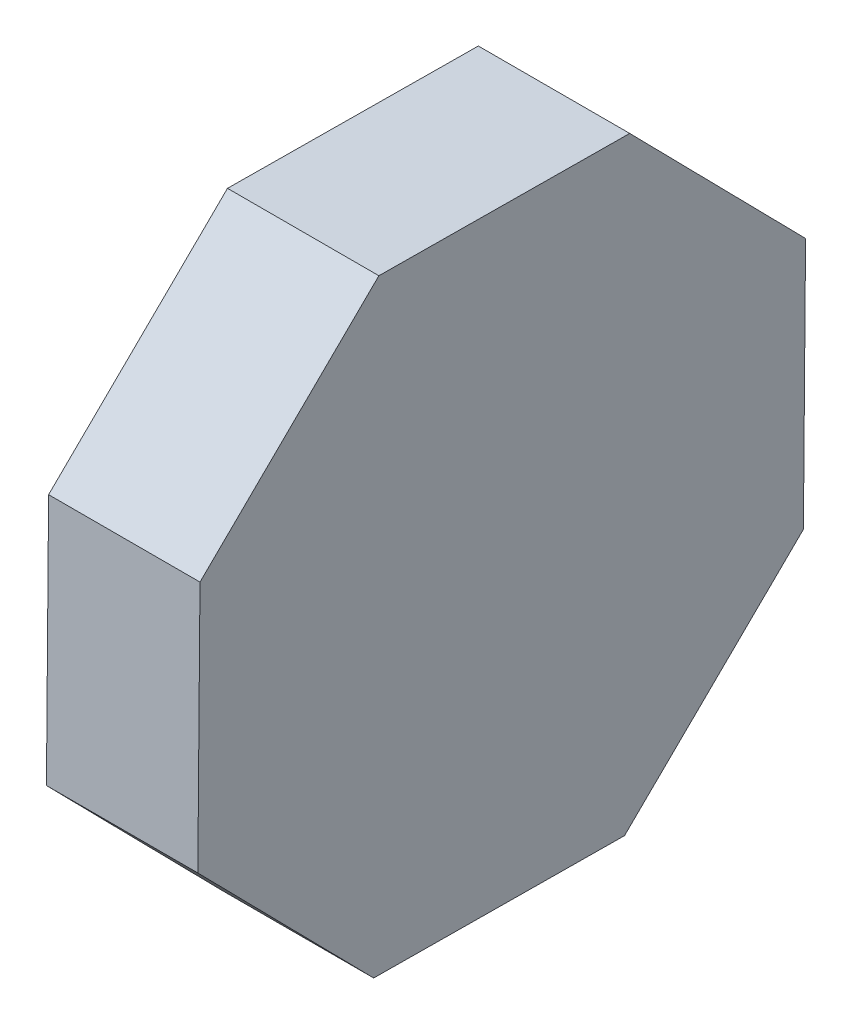
ISO-10303-21;
HEADER;
FILE_DESCRIPTION(('STEP AP214'),'2;1');
FILE_NAME('part.step','',(''),(''),'','','');
FILE_SCHEMA(('AUTOMOTIVE_DESIGN { 1 0 10303 214 1 1 1 1 }'));
ENDSEC;
DATA;
#1=APPLICATION_CONTEXT('core data for automotive mechanical design processes');
#2=APPLICATION_PROTOCOL_DEFINITION('international standard','automotive_design',2000,#1);
#3=PRODUCT_CONTEXT('',#1,'mechanical');
#4=PRODUCT('Part','Part','',(#3));
#5=PRODUCT_RELATED_PRODUCT_CATEGORY('part','',(#4));
#6=PRODUCT_DEFINITION_FORMATION('','',#4);
#7=PRODUCT_DEFINITION_CONTEXT('part definition',#1,'design');
#8=PRODUCT_DEFINITION('design','',#6,#7);
#9=PRODUCT_DEFINITION_SHAPE('','',#8);
#10=(LENGTH_UNIT() NAMED_UNIT(*) SI_UNIT(.MILLI.,.METRE.));
#11=(NAMED_UNIT(*) PLANE_ANGLE_UNIT() SI_UNIT($,.RADIAN.));
#12=(NAMED_UNIT(*) SI_UNIT($,.STERADIAN.) SOLID_ANGLE_UNIT());
#13=UNCERTAINTY_MEASURE_WITH_UNIT(LENGTH_MEASURE(1.E-05),#10,'distance_accuracy_value','');
#14=(GEOMETRIC_REPRESENTATION_CONTEXT(3) GLOBAL_UNCERTAINTY_ASSIGNED_CONTEXT((#13)) GLOBAL_UNIT_ASSIGNED_CONTEXT((#10,
#11,#12)) REPRESENTATION_CONTEXT('',''));
#15=CARTESIAN_POINT('',(0.,0.,0.));
#16=DIRECTION('',(0.,0.,1.));
#17=DIRECTION('',(1.,0.,0.));
#18=AXIS2_PLACEMENT_3D('',#15,#16,#17);
#19=CARTESIAN_POINT('',(9.525,-19.1172649539858,-7.72637729087209));
#20=DIRECTION('',(0.,0.713171623735108,0.700989468607789));
#21=DIRECTION('',(0.,-0.700989468607789,0.713171623735108));
#22=AXIS2_PLACEMENT_3D('',#19,#20,#21);
#23=PLANE('',#22);
#24=DIRECTION('',(0.,0.700989468607789,-0.713171623735108));
#25=VECTOR('',#24,1.);
#26=CARTESIAN_POINT('',(0.,-19.1172649539858,-7.72637729087209));
#27=LINE('',#26,#25);
#28=CARTESIAN_POINT('',(0.,-19.1172649539858,-7.72637729087209));
#29=VERTEX_POINT('',#28);
#30=CARTESIAN_POINT('',(0.,-8.05457391032186,-18.9813214630847));
#31=VERTEX_POINT('',#30);
#32=EDGE_CURVE('E129',#29,#31,#27,.T.);
#33=ORIENTED_EDGE('',*,*,#32,.T.);
#34=DIRECTION('',(-1.,0.,0.));
#35=VECTOR('',#34,1.);
#36=CARTESIAN_POINT('',(9.525,-8.05457391032186,-18.9813214630847));
#37=LINE('',#36,#35);
#38=CARTESIAN_POINT('',(9.525,-8.05457391032186,-18.9813214630847));
#39=VERTEX_POINT('',#38);
#40=EDGE_CURVE('E11',#39,#31,#37,.T.);
#41=ORIENTED_EDGE('',*,*,#40,.F.);
#42=DIRECTION('',(0.,0.700989468607789,-0.713171623735108));
#43=VECTOR('',#42,1.);
#44=CARTESIAN_POINT('',(9.525,-19.1172649539858,-7.72637729087209));
#45=LINE('',#44,#43);
#46=CARTESIAN_POINT('',(9.525,-19.1172649539858,-7.72637729087209));
#47=VERTEX_POINT('',#46);
#48=EDGE_CURVE('E144',#47,#39,#45,.T.);
#49=ORIENTED_EDGE('',*,*,#48,.F.);
#50=DIRECTION('',(-1.,0.,0.));
#51=VECTOR('',#50,1.);
#52=CARTESIAN_POINT('',(9.525,-19.1172649539858,-7.72637729087209));
#53=LINE('',#52,#51);
#54=EDGE_CURVE('E125',#47,#29,#53,.T.);
#55=ORIENTED_EDGE('',*,*,#54,.T.);
#56=EDGE_LOOP('',(#33,#41,#49,#55));
#57=FACE_BOUND('',#56,.T.);
#58=ADVANCED_FACE('F33',(#57),#23,.F.);
#59=CARTESIAN_POINT('',(9.525,-8.05457391032186,-18.9813214630847));
#60=DIRECTION('',(0.,0.00861408449999269,0.999962898085837));
#61=DIRECTION('',(0.,-0.999962898085838,0.00861408449999269));
#62=AXIS2_PLACEMENT_3D('',#59,#60,#61);
#63=PLANE('',#62);
#64=DIRECTION('',(0.,0.999962898085837,-0.00861408449999269));
#65=VECTOR('',#64,1.);
#66=CARTESIAN_POINT('',(0.,-8.05457391032186,-18.9813214630847));
#67=LINE('',#66,#65);
#68=CARTESIAN_POINT('',(0.,7.7263772908721,-19.1172649539857));
#69=VERTEX_POINT('',#68);
#70=EDGE_CURVE('E132',#31,#69,#67,.T.);
#71=ORIENTED_EDGE('',*,*,#70,.T.);
#72=DIRECTION('',(-1.,0.,0.));
#73=VECTOR('',#72,1.);
#74=CARTESIAN_POINT('',(9.525,7.7263772908721,-19.1172649539857));
#75=LINE('',#74,#73);
#76=CARTESIAN_POINT('',(9.525,7.7263772908721,-19.1172649539857));
#77=VERTEX_POINT('',#76);
#78=EDGE_CURVE('E41',#77,#69,#75,.T.);
#79=ORIENTED_EDGE('',*,*,#78,.F.);
#80=DIRECTION('',(0.,0.999962898085837,-0.00861408449999269));
#81=VECTOR('',#80,1.);
#82=CARTESIAN_POINT('',(9.525,-8.05457391032186,-18.9813214630847));
#83=LINE('',#82,#81);
#84=EDGE_CURVE('E92',#39,#77,#83,.T.);
#85=ORIENTED_EDGE('',*,*,#84,.F.);
#86=ORIENTED_EDGE('',*,*,#40,.T.);
#87=EDGE_LOOP('',(#71,#79,#85,#86));
#88=FACE_BOUND('',#87,.T.);
#89=ADVANCED_FACE('F200',(#88),#63,.F.);
#90=CARTESIAN_POINT('',(9.525,7.7263772908721,-19.1172649539857));
#91=DIRECTION('',(0.,-0.700989468607789,0.713171623735108));
#92=DIRECTION('',(0.,-0.713171623735108,-0.700989468607789));
#93=AXIS2_PLACEMENT_3D('',#90,#91,#92);
#94=PLANE('',#93);
#95=DIRECTION('',(0.,0.713171623735108,0.700989468607789));
#96=VECTOR('',#95,1.);
#97=CARTESIAN_POINT('',(0.,7.7263772908721,-19.1172649539857));
#98=LINE('',#97,#96);
#99=CARTESIAN_POINT('',(0.,18.9813214630847,-8.05457391032181));
#100=VERTEX_POINT('',#99);
#101=EDGE_CURVE('E135',#69,#100,#98,.T.);
#102=ORIENTED_EDGE('',*,*,#101,.T.);
#103=DIRECTION('',(-1.,0.,0.));
#104=VECTOR('',#103,1.);
#105=CARTESIAN_POINT('',(9.525,18.9813214630847,-8.05457391032181));
#106=LINE('',#105,#104);
#107=CARTESIAN_POINT('',(9.525,18.9813214630847,-8.05457391032181));
#108=VERTEX_POINT('',#107);
#109=EDGE_CURVE('E151',#108,#100,#106,.T.);
#110=ORIENTED_EDGE('',*,*,#109,.F.);
#111=DIRECTION('',(0.,0.713171623735108,0.700989468607789));
#112=VECTOR('',#111,1.);
#113=CARTESIAN_POINT('',(9.525,7.7263772908721,-19.1172649539857));
#114=LINE('',#113,#112);
#115=EDGE_CURVE('E159',#77,#108,#114,.T.);
#116=ORIENTED_EDGE('',*,*,#115,.F.);
#117=ORIENTED_EDGE('',*,*,#78,.T.);
#118=EDGE_LOOP('',(#102,#110,#116,#117));
#119=FACE_BOUND('',#118,.T.);
#120=ADVANCED_FACE('F157',(#119),#94,.F.);
#121=CARTESIAN_POINT('',(9.525,18.9813214630847,-8.05457391032181));
#122=DIRECTION('',(0.,-0.999962898085837,0.00861408449999315));
#123=DIRECTION('',(0.,-0.00861408449999315,-0.999962898085837));
#124=AXIS2_PLACEMENT_3D('',#121,#122,#123);
#125=PLANE('',#124);
#126=DIRECTION('',(0.,0.00861408449999316,0.999962898085838));
#127=VECTOR('',#126,1.);
#128=CARTESIAN_POINT('',(0.,18.9813214630847,-8.05457391032181));
#129=LINE('',#128,#127);
#130=CARTESIAN_POINT('',(0.,19.1172649539858,7.72637729087209));
#131=VERTEX_POINT('',#130);
#132=EDGE_CURVE('E137',#100,#131,#129,.T.);
#133=ORIENTED_EDGE('',*,*,#132,.T.);
#134=DIRECTION('',(-1.,0.,0.));
#135=VECTOR('',#134,1.);
#136=CARTESIAN_POINT('',(9.525,19.1172649539858,7.72637729087209));
#137=LINE('',#136,#135);
#138=CARTESIAN_POINT('',(9.525,19.1172649539858,7.72637729087209));
#139=VERTEX_POINT('',#138);
#140=EDGE_CURVE('E148',#139,#131,#137,.T.);
#141=ORIENTED_EDGE('',*,*,#140,.F.);
#142=DIRECTION('',(0.,0.00861408449999316,0.999962898085838));
#143=VECTOR('',#142,1.);
#144=CARTESIAN_POINT('',(9.525,18.9813214630847,-8.05457391032181));
#145=LINE('',#144,#143);
#146=EDGE_CURVE('E171',#108,#139,#145,.T.);
#147=ORIENTED_EDGE('',*,*,#146,.F.);
#148=ORIENTED_EDGE('',*,*,#109,.T.);
#149=EDGE_LOOP('',(#133,#141,#147,#148));
#150=FACE_BOUND('',#149,.T.);
#151=ADVANCED_FACE('F167',(#150),#125,.F.);
#152=CARTESIAN_POINT('',(9.525,19.1172649539858,7.72637729087209));
#153=DIRECTION('',(0.,-0.713171623735108,-0.700989468607789));
#154=DIRECTION('',(0.,0.700989468607789,-0.713171623735108));
#155=AXIS2_PLACEMENT_3D('',#152,#153,#154);
#156=PLANE('',#155);
#157=DIRECTION('',(0.,-0.700989468607789,0.713171623735108));
#158=VECTOR('',#157,1.);
#159=CARTESIAN_POINT('',(0.,19.1172649539858,7.72637729087209));
#160=LINE('',#159,#158);
#161=CARTESIAN_POINT('',(0.,8.05457391032185,18.9813214630847));
#162=VERTEX_POINT('',#161);
#163=EDGE_CURVE('E139',#131,#162,#160,.T.);
#164=ORIENTED_EDGE('',*,*,#163,.T.);
#165=DIRECTION('',(-1.,0.,0.));
#166=VECTOR('',#165,1.);
#167=CARTESIAN_POINT('',(9.525,8.05457391032185,18.9813214630847));
#168=LINE('',#167,#166);
#169=CARTESIAN_POINT('',(9.525,8.05457391032185,18.9813214630847));
#170=VERTEX_POINT('',#169);
#171=EDGE_CURVE('E120',#170,#162,#168,.T.);
#172=ORIENTED_EDGE('',*,*,#171,.F.);
#173=DIRECTION('',(0.,-0.700989468607789,0.713171623735108));
#174=VECTOR('',#173,1.);
#175=CARTESIAN_POINT('',(9.525,19.1172649539858,7.72637729087209));
#176=LINE('',#175,#174);
#177=EDGE_CURVE('E111',#139,#170,#176,.T.);
#178=ORIENTED_EDGE('',*,*,#177,.F.);
#179=ORIENTED_EDGE('',*,*,#140,.T.);
#180=EDGE_LOOP('',(#164,#172,#178,#179));
#181=FACE_BOUND('',#180,.T.);
#182=ADVANCED_FACE('F170',(#181),#156,.F.);
#183=CARTESIAN_POINT('',(9.525,8.05457391032185,18.9813214630847));
#184=DIRECTION('',(0.,-0.00861408449999314,-0.999962898085837));
#185=DIRECTION('',(0.,0.999962898085838,-0.00861408449999314));
#186=AXIS2_PLACEMENT_3D('',#183,#184,#185);
#187=PLANE('',#186);
#188=DIRECTION('',(0.,-0.999962898085837,0.00861408449999314));
#189=VECTOR('',#188,1.);
#190=CARTESIAN_POINT('',(0.,8.05457391032185,18.9813214630847));
#191=LINE('',#190,#189);
#192=CARTESIAN_POINT('',(0.,-7.72637729087209,19.1172649539858));
#193=VERTEX_POINT('',#192);
#194=EDGE_CURVE('E119',#162,#193,#191,.T.);
#195=ORIENTED_EDGE('',*,*,#194,.T.);
#196=DIRECTION('',(-1.,0.,0.));
#197=VECTOR('',#196,1.);
#198=CARTESIAN_POINT('',(9.525,-7.72637729087209,19.1172649539858));
#199=LINE('',#198,#197);
#200=CARTESIAN_POINT('',(9.525,-7.72637729087209,19.1172649539858));
#201=VERTEX_POINT('',#200);
#202=EDGE_CURVE('E116',#201,#193,#199,.T.);
#203=ORIENTED_EDGE('',*,*,#202,.F.);
#204=DIRECTION('',(0.,-0.999962898085837,0.00861408449999314));
#205=VECTOR('',#204,1.);
#206=CARTESIAN_POINT('',(9.525,8.05457391032185,18.9813214630847));
#207=LINE('',#206,#205);
#208=EDGE_CURVE('E105',#170,#201,#207,.T.);
#209=ORIENTED_EDGE('',*,*,#208,.F.);
#210=ORIENTED_EDGE('',*,*,#171,.T.);
#211=EDGE_LOOP('',(#195,#203,#209,#210));
#212=FACE_BOUND('',#211,.T.);
#213=ADVANCED_FACE('F117',(#212),#187,.F.);
#214=CARTESIAN_POINT('',(9.525,-7.72637729087209,19.1172649539858));
#215=DIRECTION('',(0.,0.700989468607788,-0.713171623735108));
#216=DIRECTION('',(0.,0.713171623735108,0.700989468607788));
#217=AXIS2_PLACEMENT_3D('',#214,#215,#216);
#218=PLANE('',#217);
#219=DIRECTION('',(0.,-0.713171623735108,-0.700989468607788));
#220=VECTOR('',#219,1.);
#221=CARTESIAN_POINT('',(0.,-7.72637729087209,19.1172649539858));
#222=LINE('',#221,#220);
#223=CARTESIAN_POINT('',(0.,-18.9813214630847,8.05457391032187));
#224=VERTEX_POINT('',#223);
#225=EDGE_CURVE('E78',#193,#224,#222,.T.);
#226=ORIENTED_EDGE('',*,*,#225,.T.);
#227=DIRECTION('',(-1.,0.,0.));
#228=VECTOR('',#227,1.);
#229=CARTESIAN_POINT('',(9.525,-18.9813214630847,8.05457391032187));
#230=LINE('',#229,#228);
#231=CARTESIAN_POINT('',(9.525,-18.9813214630847,8.05457391032187));
#232=VERTEX_POINT('',#231);
#233=EDGE_CURVE('E121',#232,#224,#230,.T.);
#234=ORIENTED_EDGE('',*,*,#233,.F.);
#235=DIRECTION('',(0.,-0.713171623735108,-0.700989468607788));
#236=VECTOR('',#235,1.);
#237=CARTESIAN_POINT('',(9.525,-7.72637729087209,19.1172649539858));
#238=LINE('',#237,#236);
#239=EDGE_CURVE('E109',#201,#232,#238,.T.);
#240=ORIENTED_EDGE('',*,*,#239,.F.);
#241=ORIENTED_EDGE('',*,*,#202,.T.);
#242=EDGE_LOOP('',(#226,#234,#240,#241));
#243=FACE_BOUND('',#242,.T.);
#244=ADVANCED_FACE('F123',(#243),#218,.F.);
#245=CARTESIAN_POINT('',(9.525,-18.9813214630847,8.05457391032187));
#246=DIRECTION('',(0.,0.999962898085837,-0.00861408449999356));
#247=DIRECTION('',(0.,0.00861408449999357,0.999962898085838));
#248=AXIS2_PLACEMENT_3D('',#245,#246,#247);
#249=PLANE('',#248);
#250=DIRECTION('',(0.,-0.00861408449999357,-0.999962898085837));
#251=VECTOR('',#250,1.);
#252=CARTESIAN_POINT('',(0.,-18.9813214630847,8.05457391032187));
#253=LINE('',#252,#251);
#254=EDGE_CURVE('E84',#224,#29,#253,.T.);
#255=ORIENTED_EDGE('',*,*,#254,.T.);
#256=ORIENTED_EDGE('',*,*,#54,.F.);
#257=DIRECTION('',(0.,-0.00861408449999357,-0.999962898085837));
#258=VECTOR('',#257,1.);
#259=CARTESIAN_POINT('',(9.525,-18.9813214630847,8.05457391032187));
#260=LINE('',#259,#258);
#261=EDGE_CURVE('E49',#232,#47,#260,.T.);
#262=ORIENTED_EDGE('',*,*,#261,.F.);
#263=ORIENTED_EDGE('',*,*,#233,.T.);
#264=EDGE_LOOP('',(#255,#256,#262,#263));
#265=FACE_BOUND('',#264,.T.);
#266=ADVANCED_FACE('F196',(#265),#249,.F.);
#267=CARTESIAN_POINT('',(9.525,-0.232070055175438,-26.9397688091322));
#268=DIRECTION('',(1.,0.,0.));
#269=DIRECTION('',(0.,0.,-1.));
#270=AXIS2_PLACEMENT_3D('',#267,#268,#269);
#271=PLANE('',#270);
#272=ORIENTED_EDGE('',*,*,#48,.T.);
#273=ORIENTED_EDGE('',*,*,#84,.T.);
#274=ORIENTED_EDGE('',*,*,#115,.T.);
#275=ORIENTED_EDGE('',*,*,#146,.T.);
#276=ORIENTED_EDGE('',*,*,#177,.T.);
#277=ORIENTED_EDGE('',*,*,#208,.T.);
#278=ORIENTED_EDGE('',*,*,#239,.T.);
#279=ORIENTED_EDGE('',*,*,#261,.T.);
#280=EDGE_LOOP('',(#272,#273,#274,#275,#276,#277,#278,#279));
#281=FACE_BOUND('',#280,.T.);
#282=ADVANCED_FACE('F107',(#281),#271,.T.);
#283=CARTESIAN_POINT('',(0.,-0.232070055175438,-26.9397688091322));
#284=DIRECTION('',(1.,0.,0.));
#285=DIRECTION('',(0.,0.,-1.));
#286=AXIS2_PLACEMENT_3D('',#283,#284,#285);
#287=PLANE('',#286);
#288=CARTESIAN_POINT('',(0.,0.,0.));
#289=DIRECTION('',(-1.,0.,0.));
#290=DIRECTION('',(0.,0.,1.));
#291=AXIS2_PLACEMENT_3D('',#288,#289,#290);
#292=CIRCLE('',#291,4.23545);
#293=CARTESIAN_POINT('',(0.,0.,4.23545));
#294=VERTEX_POINT('',#293);
#295=EDGE_CURVE('E177',#294,#294,#292,.T.);
#296=ORIENTED_EDGE('',*,*,#295,.F.);
#297=EDGE_LOOP('',(#296));
#298=FACE_BOUND('',#297,.T.);
#299=ORIENTED_EDGE('',*,*,#32,.F.);
#300=ORIENTED_EDGE('',*,*,#254,.F.);
#301=ORIENTED_EDGE('',*,*,#225,.F.);
#302=ORIENTED_EDGE('',*,*,#194,.F.);
#303=ORIENTED_EDGE('',*,*,#163,.F.);
#304=ORIENTED_EDGE('',*,*,#132,.F.);
#305=ORIENTED_EDGE('',*,*,#101,.F.);
#306=ORIENTED_EDGE('',*,*,#70,.F.);
#307=EDGE_LOOP('',(#299,#300,#301,#302,#303,#304,#305,#306));
#308=FACE_BOUND('',#307,.T.);
#309=ADVANCED_FACE('F163',(#298,#308),#287,.F.);
#310=CARTESIAN_POINT('',(4.7625,0.,0.));
#311=DIRECTION('',(-1.,0.,0.));
#312=DIRECTION('',(0.,0.,1.));
#313=AXIS2_PLACEMENT_3D('',#310,#311,#312);
#314=CYLINDRICAL_SURFACE('',#313,4.23545);
#315=CARTESIAN_POINT('',(4.7625,0.,0.));
#316=DIRECTION('',(-1.,0.,0.));
#317=DIRECTION('',(0.,0.,1.));
#318=AXIS2_PLACEMENT_3D('',#315,#316,#317);
#319=CIRCLE('',#318,4.23545);
#320=CARTESIAN_POINT('',(4.7625,0.,4.23545));
#321=VERTEX_POINT('',#320);
#322=EDGE_CURVE('E133',#321,#321,#319,.T.);
#323=CARTESIAN_POINT('',(4.7625,0.,4.23545));
#324=CARTESIAN_POINT('',(4.712890625,0.,4.23545));
#325=CARTESIAN_POINT('',(4.66328125,0.,4.23545));
#326=CARTESIAN_POINT('',(4.5640625,0.,4.23545));
#327=CARTESIAN_POINT('',(4.514453125,0.,4.23545));
#328=CARTESIAN_POINT('',(4.415234375,0.,4.23545));
#329=CARTESIAN_POINT('',(4.365625,0.,4.23545));
#330=CARTESIAN_POINT('',(4.26640625,0.,4.23545));
#331=CARTESIAN_POINT('',(4.216796875,0.,4.23545));
#332=CARTESIAN_POINT('',(4.117578125,0.,4.23545));
#333=CARTESIAN_POINT('',(4.06796875,0.,4.23545));
#334=CARTESIAN_POINT('',(3.96875,0.,4.23545));
#335=CARTESIAN_POINT('',(3.919140625,0.,4.23545));
#336=CARTESIAN_POINT('',(3.819921875,0.,4.23545));
#337=CARTESIAN_POINT('',(3.7703125,0.,4.23545));
#338=CARTESIAN_POINT('',(3.67109375,0.,4.23545));
#339=CARTESIAN_POINT('',(3.621484375,0.,4.23545));
#340=CARTESIAN_POINT('',(3.522265625,0.,4.23545));
#341=CARTESIAN_POINT('',(3.47265625,0.,4.23545));
#342=CARTESIAN_POINT('',(3.3734375,0.,4.23545));
#343=CARTESIAN_POINT('',(3.323828125,0.,4.23545));
#344=CARTESIAN_POINT('',(3.224609375,0.,4.23545));
#345=CARTESIAN_POINT('',(3.175,0.,4.23545));
#346=CARTESIAN_POINT('',(3.07578125,0.,4.23545));
#347=CARTESIAN_POINT('',(3.026171875,0.,4.23545));
#348=CARTESIAN_POINT('',(2.926953125,0.,4.23545));
#349=CARTESIAN_POINT('',(2.87734375,0.,4.23545));
#350=CARTESIAN_POINT('',(2.778125,0.,4.23545));
#351=CARTESIAN_POINT('',(2.728515625,0.,4.23545));
#352=CARTESIAN_POINT('',(2.629296875,0.,4.23545));
#353=CARTESIAN_POINT('',(2.5796875,0.,4.23545));
#354=CARTESIAN_POINT('',(2.48046875,0.,4.23545));
#355=CARTESIAN_POINT('',(2.430859375,0.,4.23545));
#356=CARTESIAN_POINT('',(2.331640625,0.,4.23545));
#357=CARTESIAN_POINT('',(2.28203125,0.,4.23545));
#358=CARTESIAN_POINT('',(2.1828125,0.,4.23545));
#359=CARTESIAN_POINT('',(2.133203125,0.,4.23545));
#360=CARTESIAN_POINT('',(2.033984375,0.,4.23545));
#361=CARTESIAN_POINT('',(1.984375,0.,4.23545));
#362=CARTESIAN_POINT('',(1.88515625,0.,4.23545));
#363=CARTESIAN_POINT('',(1.835546875,0.,4.23545));
#364=CARTESIAN_POINT('',(1.736328125,0.,4.23545));
#365=CARTESIAN_POINT('',(1.68671875,0.,4.23545));
#366=CARTESIAN_POINT('',(1.5875,0.,4.23545));
#367=CARTESIAN_POINT('',(1.537890625,0.,4.23545));
#368=CARTESIAN_POINT('',(1.438671875,0.,4.23545));
#369=CARTESIAN_POINT('',(1.3890625,0.,4.23545));
#370=CARTESIAN_POINT('',(1.28984375,0.,4.23545));
#371=CARTESIAN_POINT('',(1.240234375,0.,4.23545));
#372=CARTESIAN_POINT('',(1.141015625,0.,4.23545));
#373=CARTESIAN_POINT('',(1.09140625,0.,4.23545));
#374=CARTESIAN_POINT('',(0.9921875,0.,4.23545));
#375=CARTESIAN_POINT('',(0.942578125,0.,4.23545));
#376=CARTESIAN_POINT('',(0.843359375,0.,4.23545));
#377=CARTESIAN_POINT('',(0.79375,0.,4.23545));
#378=CARTESIAN_POINT('',(0.69453125,0.,4.23545));
#379=CARTESIAN_POINT('',(0.644921875,0.,4.23545));
#380=CARTESIAN_POINT('',(0.545703125,0.,4.23545));
#381=CARTESIAN_POINT('',(0.49609375,0.,4.23545));
#382=CARTESIAN_POINT('',(0.396875,0.,4.23545));
#383=CARTESIAN_POINT('',(0.347265625,0.,4.23545));
#384=CARTESIAN_POINT('',(0.248046875,0.,4.23545));
#385=CARTESIAN_POINT('',(0.1984375,0.,4.23545));
#386=CARTESIAN_POINT('',(0.09921875,0.,4.23545));
#387=CARTESIAN_POINT('',(0.049609375,0.,4.23545));
#388=CARTESIAN_POINT('',(0.,0.,4.23545));
#389=B_SPLINE_CURVE_WITH_KNOTS('',3,(#323,#324,#325,#326,#327,#328,#329,#330,#331,#332,#333,
#334,#335,#336,#337,#338,#339,#340,#341,#342,#343,#344,#345,#346,#347,#348,#349,#350,#351,#352,
#353,#354,#355,#356,#357,#358,#359,#360,#361,#362,#363,#364,#365,#366,#367,#368,#369,#370,#371,
#372,#373,#374,#375,#376,#377,#378,#379,#380,#381,#382,#383,#384,#385,#386,#387,#388),
.UNSPECIFIED.,.F.,.F.,(4,2,2,2,2,2,2,2,2,2,2,2,2,2,2,2,2,2,2,2,2,2,2,2,2,2,2,2,2,2,2,2,4),(0.,
0.148828125,0.29765625,0.446484375,0.5953125,0.744140625,0.892968750000001,1.041796875,1.190625,
1.339453125,1.48828125,1.637109375,1.7859375,1.934765625,2.08359375,2.232421875,2.38125,
2.530078125,2.67890625,2.827734375,2.9765625,3.125390625,3.27421875,3.423046875,3.571875,
3.720703125,3.86953125,4.018359375,4.1671875,4.316015625,4.46484375,4.613671875,4.7625),.UNSPECIFIED.);
#390=EDGE_CURVE('BSEAM185',#321,#294,#389,.T.);
#391=ORIENTED_EDGE('',*,*,#322,.F.);
#392=ORIENTED_EDGE('',*,*,#295,.T.);
#393=ORIENTED_EDGE('',*,*,#390,.T.);
#394=ORIENTED_EDGE('',*,*,#390,.F.);
#395=EDGE_LOOP('',(#391,#393,#392,#394));
#396=FACE_BOUND('',#395,.T.);
#397=ADVANCED_FACE('F185',(#396),#314,.F.);
#398=CARTESIAN_POINT('',(4.7625,0.,0.));
#399=DIRECTION('',(-1.,0.,0.));
#400=DIRECTION('',(0.,0.,1.));
#401=AXIS2_PLACEMENT_3D('',#398,#399,#400);
#402=PLANE('',#401);
#403=ORIENTED_EDGE('',*,*,#322,.T.);
#404=EDGE_LOOP('',(#403));
#405=FACE_BOUND('',#404,.T.);
#406=ADVANCED_FACE('F183',(#405),#402,.T.);
#407=CLOSED_SHELL('',(#58,#89,#120,#151,#182,#213,#244,#266,#282,#309,#397,#406));
#408=MANIFOLD_SOLID_BREP('B2',#407);
#409=ADVANCED_BREP_SHAPE_REPRESENTATION('',(#18,#408),#14);
#410=SHAPE_DEFINITION_REPRESENTATION(#9,#409);
ENDSEC;
END-ISO-10303-21;
